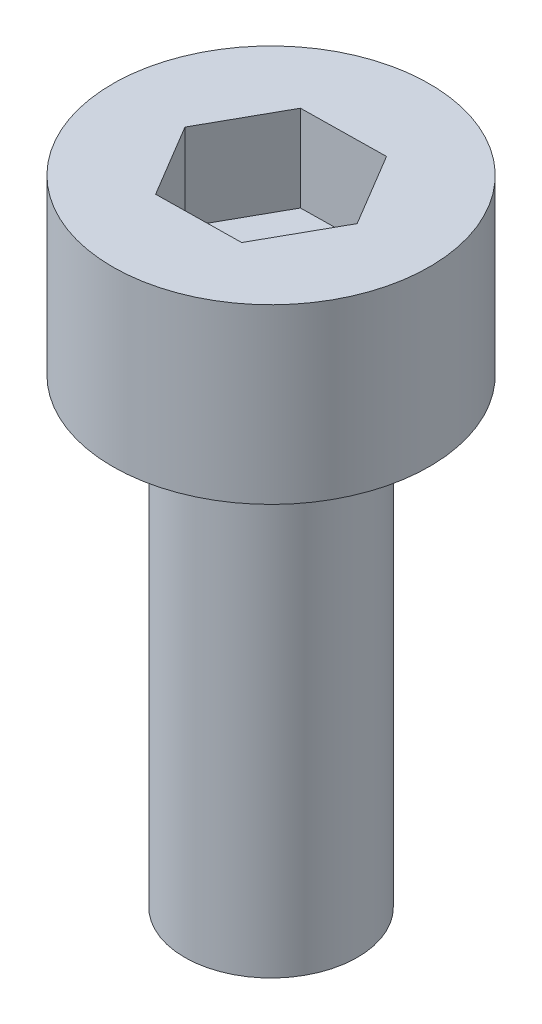
ISO-10303-21;
HEADER;
FILE_DESCRIPTION(('STEP AP214'),'2;1');
FILE_NAME('part.step','',(''),(''),'','','');
FILE_SCHEMA(('AUTOMOTIVE_DESIGN { 1 0 10303 214 1 1 1 1 }'));
ENDSEC;
DATA;
#1=APPLICATION_CONTEXT('core data for automotive mechanical design processes');
#2=APPLICATION_PROTOCOL_DEFINITION('international standard','automotive_design',2000,#1);
#3=PRODUCT_CONTEXT('',#1,'mechanical');
#4=PRODUCT('Part','Part','',(#3));
#5=PRODUCT_RELATED_PRODUCT_CATEGORY('part','',(#4));
#6=PRODUCT_DEFINITION_FORMATION('','',#4);
#7=PRODUCT_DEFINITION_CONTEXT('part definition',#1,'design');
#8=PRODUCT_DEFINITION('design','',#6,#7);
#9=PRODUCT_DEFINITION_SHAPE('','',#8);
#10=(LENGTH_UNIT() NAMED_UNIT(*) SI_UNIT(.MILLI.,.METRE.));
#11=(NAMED_UNIT(*) PLANE_ANGLE_UNIT() SI_UNIT($,.RADIAN.));
#12=(NAMED_UNIT(*) SI_UNIT($,.STERADIAN.) SOLID_ANGLE_UNIT());
#13=UNCERTAINTY_MEASURE_WITH_UNIT(LENGTH_MEASURE(1.E-05),#10,'distance_accuracy_value','');
#14=(GEOMETRIC_REPRESENTATION_CONTEXT(3) GLOBAL_UNCERTAINTY_ASSIGNED_CONTEXT((#13)) GLOBAL_UNIT_ASSIGNED_CONTEXT((#10,
#11,#12)) REPRESENTATION_CONTEXT('',''));
#15=CARTESIAN_POINT('',(0.,0.,0.));
#16=DIRECTION('',(0.,0.,1.));
#17=DIRECTION('',(1.,0.,0.));
#18=AXIS2_PLACEMENT_3D('',#15,#16,#17);
#19=CARTESIAN_POINT('',(0.,8.,0.));
#20=DIRECTION('',(0.,-1.,0.));
#21=DIRECTION('',(0.,0.,-1.));
#22=AXIS2_PLACEMENT_3D('',#19,#20,#21);
#23=CYLINDRICAL_SURFACE('',#22,1.5);
#24=CARTESIAN_POINT('',(0.,8.,0.));
#25=DIRECTION('',(0.,1.,0.));
#26=DIRECTION('',(0.,0.,1.));
#27=AXIS2_PLACEMENT_3D('',#24,#25,#26);
#28=CIRCLE('',#27,1.5);
#29=CARTESIAN_POINT('',(0.,8.,1.5));
#30=VERTEX_POINT('',#29);
#31=EDGE_CURVE('E11',#30,#30,#28,.T.);
#32=ORIENTED_EDGE('',*,*,#31,.F.);
#33=EDGE_LOOP('',(#32));
#34=FACE_BOUND('',#33,.T.);
#35=CARTESIAN_POINT('',(0.,0.,0.));
#36=DIRECTION('',(0.,1.,0.));
#37=DIRECTION('',(0.,0.,1.));
#38=AXIS2_PLACEMENT_3D('',#35,#36,#37);
#39=CIRCLE('',#38,1.5);
#40=CARTESIAN_POINT('',(0.,0.,1.5));
#41=VERTEX_POINT('',#40);
#42=EDGE_CURVE('E24',#41,#41,#39,.T.);
#43=ORIENTED_EDGE('',*,*,#42,.T.);
#44=EDGE_LOOP('',(#43));
#45=FACE_BOUND('',#44,.T.);
#46=ADVANCED_FACE('F17',(#34,#45),#23,.T.);
#47=CARTESIAN_POINT('',(0.,0.,0.));
#48=DIRECTION('',(0.,1.,0.));
#49=DIRECTION('',(0.,0.,1.));
#50=AXIS2_PLACEMENT_3D('',#47,#48,#49);
#51=PLANE('',#50);
#52=ORIENTED_EDGE('',*,*,#42,.F.);
#53=EDGE_LOOP('',(#52));
#54=FACE_BOUND('',#53,.T.);
#55=ADVANCED_FACE('F132',(#54),#51,.F.);
#56=CARTESIAN_POINT('',(0.,11.,0.));
#57=DIRECTION('',(0.,-1.,0.));
#58=DIRECTION('',(0.,0.,-1.));
#59=AXIS2_PLACEMENT_3D('',#56,#57,#58);
#60=CYLINDRICAL_SURFACE('',#59,2.75);
#61=CARTESIAN_POINT('',(0.,11.,0.));
#62=DIRECTION('',(0.,1.,0.));
#63=DIRECTION('',(0.,0.,1.));
#64=AXIS2_PLACEMENT_3D('',#61,#62,#63);
#65=CIRCLE('',#64,2.75);
#66=CARTESIAN_POINT('',(0.,11.,2.75));
#67=VERTEX_POINT('',#66);
#68=EDGE_CURVE('E126',#67,#67,#65,.T.);
#69=ORIENTED_EDGE('',*,*,#68,.F.);
#70=EDGE_LOOP('',(#69));
#71=FACE_BOUND('',#70,.T.);
#72=CARTESIAN_POINT('',(0.,8.,0.));
#73=DIRECTION('',(0.,1.,0.));
#74=DIRECTION('',(0.,0.,1.));
#75=AXIS2_PLACEMENT_3D('',#72,#73,#74);
#76=CIRCLE('',#75,2.75);
#77=CARTESIAN_POINT('',(0.,8.,2.75));
#78=VERTEX_POINT('',#77);
#79=EDGE_CURVE('E123',#78,#78,#76,.T.);
#80=ORIENTED_EDGE('',*,*,#79,.T.);
#81=EDGE_LOOP('',(#80));
#82=FACE_BOUND('',#81,.T.);
#83=ADVANCED_FACE('F134',(#71,#82),#60,.T.);
#84=CARTESIAN_POINT('',(0.,11.,0.));
#85=DIRECTION('',(0.,1.,0.));
#86=DIRECTION('',(0.,0.,1.));
#87=AXIS2_PLACEMENT_3D('',#84,#85,#86);
#88=PLANE('',#87);
#89=DIRECTION('',(0.999893086922528,0.,-0.0146224048821464));
#90=VECTOR('',#89,1.);
#91=CARTESIAN_POINT('',(-0.717399325967113,11.,1.28562755380473));
#92=LINE('',#91,#90);
#93=CARTESIAN_POINT('',(-0.717399325967113,11.,1.28562755380473));
#94=VERTEX_POINT('',#93);
#95=CARTESIAN_POINT('',(0.754686458416585,11.,1.26409981784772));
#96=VERTEX_POINT('',#95);
#97=EDGE_CURVE('E31',#94,#96,#92,.T.);
#98=ORIENTED_EDGE('',*,*,#97,.F.);
#99=DIRECTION('',(0.512609917553624,0.,0.858621611902278));
#100=VECTOR('',#99,1.);
#101=CARTESIAN_POINT('',(-1.4720857843837,11.,0.0215277359570126));
#102=LINE('',#101,#100);
#103=CARTESIAN_POINT('',(-1.4720857843837,11.,0.0215277359570126));
#104=VERTEX_POINT('',#103);
#105=EDGE_CURVE('E36',#104,#94,#102,.T.);
#106=ORIENTED_EDGE('',*,*,#105,.F.);
#107=DIRECTION('',(-0.487283169368904,0.,0.873244016784424));
#108=VECTOR('',#107,1.);
#109=CARTESIAN_POINT('',(-0.754686458416585,11.,-1.26409981784772));
#110=LINE('',#109,#108);
#111=CARTESIAN_POINT('',(-0.754686458416585,11.,-1.26409981784772));
#112=VERTEX_POINT('',#111);
#113=EDGE_CURVE('E118',#112,#104,#110,.T.);
#114=ORIENTED_EDGE('',*,*,#113,.F.);
#115=DIRECTION('',(-0.999893086922528,0.,0.0146224048821461));
#116=VECTOR('',#115,1.);
#117=CARTESIAN_POINT('',(0.717399325967112,11.,-1.28562755380473));
#118=LINE('',#117,#116);
#119=CARTESIAN_POINT('',(0.717399325967112,11.,-1.28562755380473));
#120=VERTEX_POINT('',#119);
#121=EDGE_CURVE('E115',#120,#112,#118,.T.);
#122=ORIENTED_EDGE('',*,*,#121,.F.);
#123=DIRECTION('',(-0.512609917553624,0.,-0.858621611902278));
#124=VECTOR('',#123,1.);
#125=CARTESIAN_POINT('',(1.4720857843837,11.,-0.0215277359570131));
#126=LINE('',#125,#124);
#127=CARTESIAN_POINT('',(1.4720857843837,11.,-0.0215277359570131));
#128=VERTEX_POINT('',#127);
#129=EDGE_CURVE('E113',#128,#120,#126,.T.);
#130=ORIENTED_EDGE('',*,*,#129,.F.);
#131=DIRECTION('',(0.487283169368904,0.,-0.873244016784425));
#132=VECTOR('',#131,1.);
#133=CARTESIAN_POINT('',(0.754686458416585,11.,1.26409981784772));
#134=LINE('',#133,#132);
#135=EDGE_CURVE('E87',#96,#128,#134,.T.);
#136=ORIENTED_EDGE('',*,*,#135,.F.);
#137=EDGE_LOOP('',(#98,#106,#114,#122,#130,#136));
#138=FACE_BOUND('',#137,.T.);
#139=ORIENTED_EDGE('',*,*,#68,.T.);
#140=EDGE_LOOP('',(#139));
#141=FACE_BOUND('',#140,.T.);
#142=ADVANCED_FACE('F140',(#138,#141),#88,.T.);
#143=CARTESIAN_POINT('',(0.,8.,0.));
#144=DIRECTION('',(0.,1.,0.));
#145=DIRECTION('',(0.,0.,1.));
#146=AXIS2_PLACEMENT_3D('',#143,#144,#145);
#147=PLANE('',#146);
#148=ORIENTED_EDGE('',*,*,#31,.T.);
#149=EDGE_LOOP('',(#148));
#150=FACE_BOUND('',#149,.T.);
#151=ORIENTED_EDGE('',*,*,#79,.F.);
#152=EDGE_LOOP('',(#151));
#153=FACE_BOUND('',#152,.T.);
#154=ADVANCED_FACE('F147',(#150,#153),#147,.F.);
#155=CARTESIAN_POINT('',(-0.717399325967113,9.5,1.28562755380473));
#156=DIRECTION('',(0.0146224048821464,0.,0.999893086922528));
#157=DIRECTION('',(0.999893086922528,0.,-0.0146224048821464));
#158=AXIS2_PLACEMENT_3D('',#155,#156,#157);
#159=PLANE('',#158);
#160=ORIENTED_EDGE('',*,*,#97,.T.);
#161=DIRECTION('',(0.,1.,0.));
#162=VECTOR('',#161,1.);
#163=CARTESIAN_POINT('',(0.754686458416585,9.5,1.26409981784772));
#164=LINE('',#163,#162);
#165=CARTESIAN_POINT('',(0.754686458416585,9.5,1.26409981784772));
#166=VERTEX_POINT('',#165);
#167=EDGE_CURVE('E110',#166,#96,#164,.T.);
#168=ORIENTED_EDGE('',*,*,#167,.F.);
#169=DIRECTION('',(0.999893086922528,0.,-0.0146224048821464));
#170=VECTOR('',#169,1.);
#171=CARTESIAN_POINT('',(-0.717399325967113,9.5,1.28562755380473));
#172=LINE('',#171,#170);
#173=CARTESIAN_POINT('',(-0.717399325967113,9.5,1.28562755380473));
#174=VERTEX_POINT('',#173);
#175=EDGE_CURVE('E91',#174,#166,#172,.T.);
#176=ORIENTED_EDGE('',*,*,#175,.F.);
#177=DIRECTION('',(0.,1.,0.));
#178=VECTOR('',#177,1.);
#179=CARTESIAN_POINT('',(-0.717399325967113,9.5,1.28562755380473));
#180=LINE('',#179,#178);
#181=EDGE_CURVE('E107',#174,#94,#180,.T.);
#182=ORIENTED_EDGE('',*,*,#181,.T.);
#183=EDGE_LOOP('',(#160,#168,#176,#182));
#184=FACE_BOUND('',#183,.T.);
#185=ADVANCED_FACE('F150',(#184),#159,.F.);
#186=CARTESIAN_POINT('',(-1.4720857843837,9.5,0.0215277359570126));
#187=DIRECTION('',(-0.858621611902278,0.,0.512609917553624));
#188=DIRECTION('',(0.512609917553624,0.,0.858621611902278));
#189=AXIS2_PLACEMENT_3D('',#186,#187,#188);
#190=PLANE('',#189);
#191=ORIENTED_EDGE('',*,*,#105,.T.);
#192=ORIENTED_EDGE('',*,*,#181,.F.);
#193=DIRECTION('',(0.512609917553624,0.,0.858621611902278));
#194=VECTOR('',#193,1.);
#195=CARTESIAN_POINT('',(-1.4720857843837,9.5,0.0215277359570126));
#196=LINE('',#195,#194);
#197=CARTESIAN_POINT('',(-1.4720857843837,9.5,0.0215277359570126));
#198=VERTEX_POINT('',#197);
#199=EDGE_CURVE('E105',#198,#174,#196,.T.);
#200=ORIENTED_EDGE('',*,*,#199,.F.);
#201=DIRECTION('',(0.,1.,0.));
#202=VECTOR('',#201,1.);
#203=CARTESIAN_POINT('',(-1.4720857843837,9.5,0.0215277359570126));
#204=LINE('',#203,#202);
#205=EDGE_CURVE('E103',#198,#104,#204,.T.);
#206=ORIENTED_EDGE('',*,*,#205,.T.);
#207=EDGE_LOOP('',(#191,#192,#200,#206));
#208=FACE_BOUND('',#207,.T.);
#209=ADVANCED_FACE('F154',(#208),#190,.F.);
#210=CARTESIAN_POINT('',(-0.754686458416585,9.5,-1.26409981784772));
#211=DIRECTION('',(-0.873244016784425,0.,-0.487283169368904));
#212=DIRECTION('',(-0.487283169368904,0.,0.873244016784425));
#213=AXIS2_PLACEMENT_3D('',#210,#211,#212);
#214=PLANE('',#213);
#215=ORIENTED_EDGE('',*,*,#113,.T.);
#216=ORIENTED_EDGE('',*,*,#205,.F.);
#217=DIRECTION('',(-0.487283169368904,0.,0.873244016784424));
#218=VECTOR('',#217,1.);
#219=CARTESIAN_POINT('',(-0.754686458416585,9.5,-1.26409981784772));
#220=LINE('',#219,#218);
#221=CARTESIAN_POINT('',(-0.754686458416585,9.5,-1.26409981784772));
#222=VERTEX_POINT('',#221);
#223=EDGE_CURVE('E100',#222,#198,#220,.T.);
#224=ORIENTED_EDGE('',*,*,#223,.F.);
#225=DIRECTION('',(0.,1.,0.));
#226=VECTOR('',#225,1.);
#227=CARTESIAN_POINT('',(-0.754686458416585,9.5,-1.26409981784772));
#228=LINE('',#227,#226);
#229=EDGE_CURVE('E97',#222,#112,#228,.T.);
#230=ORIENTED_EDGE('',*,*,#229,.T.);
#231=EDGE_LOOP('',(#215,#216,#224,#230));
#232=FACE_BOUND('',#231,.T.);
#233=ADVANCED_FACE('F158',(#232),#214,.F.);
#234=CARTESIAN_POINT('',(0.717399325967112,9.5,-1.28562755380473));
#235=DIRECTION('',(-0.0146224048821461,0.,-0.999893086922528));
#236=DIRECTION('',(-0.999893086922528,0.,0.0146224048821461));
#237=AXIS2_PLACEMENT_3D('',#234,#235,#236);
#238=PLANE('',#237);
#239=ORIENTED_EDGE('',*,*,#121,.T.);
#240=ORIENTED_EDGE('',*,*,#229,.F.);
#241=DIRECTION('',(-0.999893086922528,0.,0.0146224048821461));
#242=VECTOR('',#241,1.);
#243=CARTESIAN_POINT('',(0.717399325967112,9.5,-1.28562755380473));
#244=LINE('',#243,#242);
#245=CARTESIAN_POINT('',(0.717399325967112,9.5,-1.28562755380473));
#246=VERTEX_POINT('',#245);
#247=EDGE_CURVE('E95',#246,#222,#244,.T.);
#248=ORIENTED_EDGE('',*,*,#247,.F.);
#249=DIRECTION('',(0.,1.,0.));
#250=VECTOR('',#249,1.);
#251=CARTESIAN_POINT('',(0.717399325967112,9.5,-1.28562755380473));
#252=LINE('',#251,#250);
#253=EDGE_CURVE('E76',#246,#120,#252,.T.);
#254=ORIENTED_EDGE('',*,*,#253,.T.);
#255=EDGE_LOOP('',(#239,#240,#248,#254));
#256=FACE_BOUND('',#255,.T.);
#257=ADVANCED_FACE('F162',(#256),#238,.F.);
#258=CARTESIAN_POINT('',(1.4720857843837,9.5,-0.0215277359570131));
#259=DIRECTION('',(0.858621611902278,0.,-0.512609917553624));
#260=DIRECTION('',(-0.512609917553624,0.,-0.858621611902278));
#261=AXIS2_PLACEMENT_3D('',#258,#259,#260);
#262=PLANE('',#261);
#263=ORIENTED_EDGE('',*,*,#129,.T.);
#264=ORIENTED_EDGE('',*,*,#253,.F.);
#265=DIRECTION('',(-0.512609917553624,0.,-0.858621611902278));
#266=VECTOR('',#265,1.);
#267=CARTESIAN_POINT('',(1.4720857843837,9.5,-0.0215277359570131));
#268=LINE('',#267,#266);
#269=CARTESIAN_POINT('',(1.4720857843837,9.5,-0.0215277359570131));
#270=VERTEX_POINT('',#269);
#271=EDGE_CURVE('E69',#270,#246,#268,.T.);
#272=ORIENTED_EDGE('',*,*,#271,.F.);
#273=DIRECTION('',(0.,1.,0.));
#274=VECTOR('',#273,1.);
#275=CARTESIAN_POINT('',(1.4720857843837,9.5,-0.0215277359570131));
#276=LINE('',#275,#274);
#277=EDGE_CURVE('E73',#270,#128,#276,.T.);
#278=ORIENTED_EDGE('',*,*,#277,.T.);
#279=EDGE_LOOP('',(#263,#264,#272,#278));
#280=FACE_BOUND('',#279,.T.);
#281=ADVANCED_FACE('F72',(#280),#262,.F.);
#282=CARTESIAN_POINT('',(0.754686458416585,9.5,1.26409981784772));
#283=DIRECTION('',(0.873244016784425,0.,0.487283169368904));
#284=DIRECTION('',(0.487283169368904,0.,-0.873244016784425));
#285=AXIS2_PLACEMENT_3D('',#282,#283,#284);
#286=PLANE('',#285);
#287=ORIENTED_EDGE('',*,*,#135,.T.);
#288=ORIENTED_EDGE('',*,*,#277,.F.);
#289=DIRECTION('',(0.487283169368904,0.,-0.873244016784425));
#290=VECTOR('',#289,1.);
#291=CARTESIAN_POINT('',(0.754686458416585,9.5,1.26409981784772));
#292=LINE('',#291,#290);
#293=EDGE_CURVE('E85',#166,#270,#292,.T.);
#294=ORIENTED_EDGE('',*,*,#293,.F.);
#295=ORIENTED_EDGE('',*,*,#167,.T.);
#296=EDGE_LOOP('',(#287,#288,#294,#295));
#297=FACE_BOUND('',#296,.T.);
#298=ADVANCED_FACE('F83',(#297),#286,.F.);
#299=CARTESIAN_POINT('',(0.,9.5,0.));
#300=DIRECTION('',(0.,1.,0.));
#301=DIRECTION('',(0.,0.,1.));
#302=AXIS2_PLACEMENT_3D('',#299,#300,#301);
#303=PLANE('',#302);
#304=ORIENTED_EDGE('',*,*,#175,.T.);
#305=ORIENTED_EDGE('',*,*,#293,.T.);
#306=ORIENTED_EDGE('',*,*,#271,.T.);
#307=ORIENTED_EDGE('',*,*,#247,.T.);
#308=ORIENTED_EDGE('',*,*,#223,.T.);
#309=ORIENTED_EDGE('',*,*,#199,.T.);
#310=EDGE_LOOP('',(#304,#305,#306,#307,#308,#309));
#311=FACE_BOUND('',#310,.T.);
#312=ADVANCED_FACE('F89',(#311),#303,.T.);
#313=CLOSED_SHELL('',(#46,#55,#83,#142,#154,#185,#209,#233,#257,#281,#298,#312));
#314=MANIFOLD_SOLID_BREP('B1',#313);
#315=ADVANCED_BREP_SHAPE_REPRESENTATION('',(#18,#314),#14);
#316=SHAPE_DEFINITION_REPRESENTATION(#9,#315);
ENDSEC;
END-ISO-10303-21;
